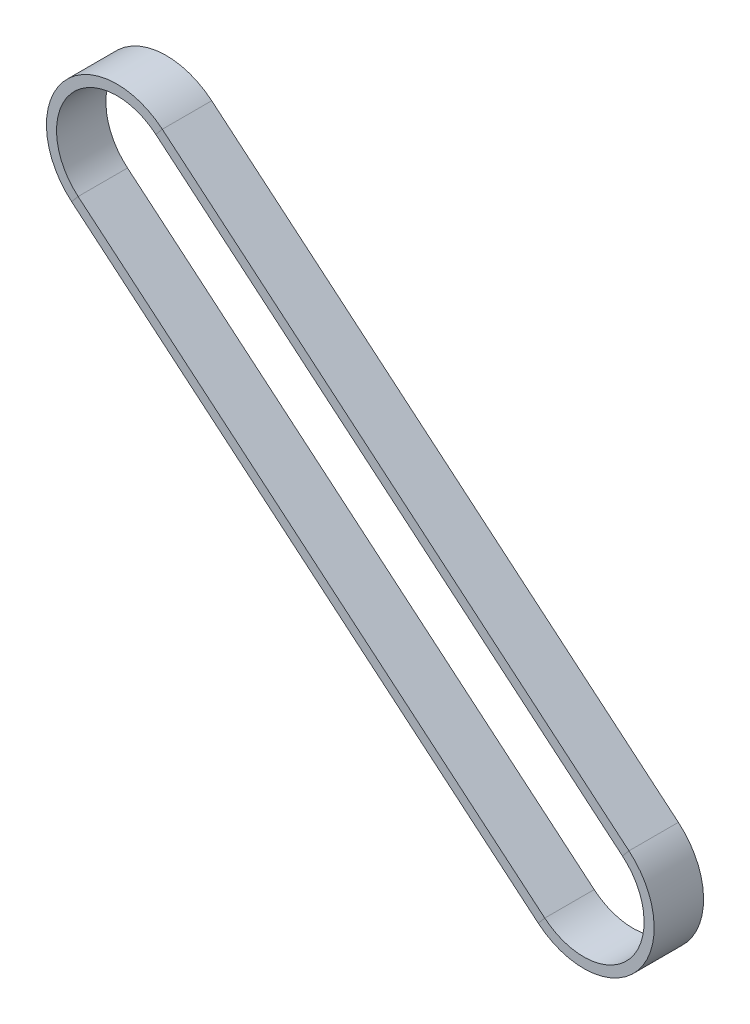
ISO-10303-21;
HEADER;
FILE_DESCRIPTION(('STEP AP214'),'2;1');
FILE_NAME('part.step','',(''),(''),'','','');
FILE_SCHEMA(('AUTOMOTIVE_DESIGN { 1 0 10303 214 1 1 1 1 }'));
ENDSEC;
DATA;
#1=APPLICATION_CONTEXT('core data for automotive mechanical design processes');
#2=APPLICATION_PROTOCOL_DEFINITION('international standard','automotive_design',2000,#1);
#3=PRODUCT_CONTEXT('',#1,'mechanical');
#4=PRODUCT('Part','Part','',(#3));
#5=PRODUCT_RELATED_PRODUCT_CATEGORY('part','',(#4));
#6=PRODUCT_DEFINITION_FORMATION('','',#4);
#7=PRODUCT_DEFINITION_CONTEXT('part definition',#1,'design');
#8=PRODUCT_DEFINITION('design','',#6,#7);
#9=PRODUCT_DEFINITION_SHAPE('','',#8);
#10=(LENGTH_UNIT() NAMED_UNIT(*) SI_UNIT(.MILLI.,.METRE.));
#11=(NAMED_UNIT(*) PLANE_ANGLE_UNIT() SI_UNIT($,.RADIAN.));
#12=(NAMED_UNIT(*) SI_UNIT($,.STERADIAN.) SOLID_ANGLE_UNIT());
#13=UNCERTAINTY_MEASURE_WITH_UNIT(LENGTH_MEASURE(1.E-05),#10,'distance_accuracy_value','');
#14=(GEOMETRIC_REPRESENTATION_CONTEXT(3) GLOBAL_UNCERTAINTY_ASSIGNED_CONTEXT((#13)) GLOBAL_UNIT_ASSIGNED_CONTEXT((#10,
#11,#12)) REPRESENTATION_CONTEXT('',''));
#15=CARTESIAN_POINT('',(0.,0.,0.));
#16=DIRECTION('',(0.,0.,1.));
#17=DIRECTION('',(1.,0.,0.));
#18=AXIS2_PLACEMENT_3D('',#15,#16,#17);
#19=CARTESIAN_POINT('',(-13.7664118631083,-16.4061707949908,7.5));
#20=DIRECTION('',(0.,0.,-1.));
#21=DIRECTION('',(-1.,0.,0.));
#22=AXIS2_PLACEMENT_3D('',#19,#20,#21);
#23=PLANE('',#22);
#24=DIRECTION('',(0.642787609686541,0.766044443118977,0.));
#25=VECTOR('',#24,1.);
#26=CARTESIAN_POINT('',(-13.7664118631083,-16.4061707949908,7.5));
#27=LINE('',#26,#25);
#28=CARTESIAN_POINT('',(-13.7664118631083,-16.4061707949908,7.5));
#29=VERTEX_POINT('',#28);
#30=CARTESIAN_POINT('',(-11.7994817774675,-14.0620747990467,7.5));
#31=VERTEX_POINT('',#30);
#32=EDGE_CURVE('E155',#29,#31,#27,.T.);
#33=ORIENTED_EDGE('',*,*,#32,.F.);
#34=CARTESIAN_POINT('',(0.,0.,7.5));
#35=DIRECTION('',(0.,0.,1.));
#36=DIRECTION('',(-0.64278760968654,-0.766044443118977,0.));
#37=AXIS2_PLACEMENT_3D('',#34,#35,#36);
#38=CIRCLE('',#37,21.4167349458114);
#39=CARTESIAN_POINT('',(13.7664118631083,16.4061707949908,7.5));
#40=VERTEX_POINT('',#39);
#41=EDGE_CURVE('E154',#29,#40,#38,.T.);
#42=ORIENTED_EDGE('',*,*,#41,.T.);
#43=DIRECTION('',(-0.642787609686541,-0.766044443118977,0.));
#44=VECTOR('',#43,1.);
#45=CARTESIAN_POINT('',(13.7664118631083,16.4061707949908,7.5));
#46=LINE('',#45,#44);
#47=CARTESIAN_POINT('',(11.7994817774675,14.0620747990467,7.5));
#48=VERTEX_POINT('',#47);
#49=EDGE_CURVE('E133',#40,#48,#46,.T.);
#50=ORIENTED_EDGE('',*,*,#49,.T.);
#51=CARTESIAN_POINT('',(0.,0.,7.5));
#52=DIRECTION('',(0.,0.,1.));
#53=DIRECTION('',(-0.64278760968654,-0.766044443118977,0.));
#54=AXIS2_PLACEMENT_3D('',#51,#52,#53);
#55=CIRCLE('',#54,18.3567349458114);
#56=EDGE_CURVE('E159',#31,#48,#55,.T.);
#57=ORIENTED_EDGE('',*,*,#56,.F.);
#58=EDGE_LOOP('',(#33,#42,#50,#57));
#59=FACE_BOUND('',#58,.T.);
#60=ADVANCED_FACE('F39',(#59),#23,.F.);
#61=CARTESIAN_POINT('',(13.7664118631083,16.4061707949908,7.5));
#62=DIRECTION('',(0.,0.,-1.));
#63=DIRECTION('',(0.,1.,0.));
#64=AXIS2_PLACEMENT_3D('',#61,#62,#63);
#65=PLANE('',#64);
#66=DIRECTION('',(-0.766044443118977,0.64278760968654,0.));
#67=VECTOR('',#66,1.);
#68=CARTESIAN_POINT('',(11.7994817774675,14.0620747990467,7.5));
#69=LINE('',#68,#67);
#70=CARTESIAN_POINT('',(-129.918740199543,132.977782591057,7.5));
#71=VERTEX_POINT('',#70);
#72=EDGE_CURVE('E123',#48,#71,#69,.T.);
#73=ORIENTED_EDGE('',*,*,#72,.F.);
#74=ORIENTED_EDGE('',*,*,#49,.F.);
#75=DIRECTION('',(-0.766044443118977,0.64278760968654,0.));
#76=VECTOR('',#75,1.);
#77=CARTESIAN_POINT('',(13.7664118631083,16.4061707949908,7.5));
#78=LINE('',#77,#76);
#79=CARTESIAN_POINT('',(-127.951810113902,135.321878587001,7.5));
#80=VERTEX_POINT('',#79);
#81=EDGE_CURVE('E136',#40,#80,#78,.T.);
#82=ORIENTED_EDGE('',*,*,#81,.T.);
#83=DIRECTION('',(-0.642787609686541,-0.766044443118977,0.));
#84=VECTOR('',#83,1.);
#85=CARTESIAN_POINT('',(-127.951810113902,135.321878587001,7.5));
#86=LINE('',#85,#84);
#87=EDGE_CURVE('E151',#80,#71,#86,.T.);
#88=ORIENTED_EDGE('',*,*,#87,.T.);
#89=EDGE_LOOP('',(#73,#74,#82,#88));
#90=FACE_BOUND('',#89,.T.);
#91=ADVANCED_FACE('F135',(#90),#65,.F.);
#92=CARTESIAN_POINT('',(11.7994817774675,14.0620747990467,7.5));
#93=DIRECTION('',(0.64278760968654,0.766044443118977,0.));
#94=DIRECTION('',(-0.766044443118977,0.642787609686541,0.));
#95=AXIS2_PLACEMENT_3D('',#92,#93,#94);
#96=PLANE('',#95);
#97=DIRECTION('',(-0.766044443118977,0.64278760968654,0.));
#98=VECTOR('',#97,1.);
#99=CARTESIAN_POINT('',(11.7994817774675,14.0620747990467,-7.5));
#100=LINE('',#99,#98);
#101=CARTESIAN_POINT('',(11.7994817774675,14.0620747990467,-7.5));
#102=VERTEX_POINT('',#101);
#103=CARTESIAN_POINT('',(-129.918740199543,132.977782591057,-7.5));
#104=VERTEX_POINT('',#103);
#105=EDGE_CURVE('E117',#102,#104,#100,.T.);
#106=ORIENTED_EDGE('',*,*,#105,.F.);
#107=DIRECTION('',(0.,0.,-1.));
#108=VECTOR('',#107,1.);
#109=CARTESIAN_POINT('',(11.7994817774675,14.0620747990467,7.5));
#110=LINE('',#109,#108);
#111=EDGE_CURVE('E141',#48,#102,#110,.T.);
#112=ORIENTED_EDGE('',*,*,#111,.F.);
#113=ORIENTED_EDGE('',*,*,#72,.T.);
#114=DIRECTION('',(0.,0.,-1.));
#115=VECTOR('',#114,1.);
#116=CARTESIAN_POINT('',(-129.918740199543,132.977782591057,7.5));
#117=LINE('',#116,#115);
#118=EDGE_CURVE('E199',#71,#104,#117,.T.);
#119=ORIENTED_EDGE('',*,*,#118,.T.);
#120=EDGE_LOOP('',(#106,#112,#113,#119));
#121=FACE_BOUND('',#120,.T.);
#122=ADVANCED_FACE('F218',(#121),#96,.F.);
#123=CARTESIAN_POINT('',(13.7664118631083,16.4061707949908,-7.5));
#124=DIRECTION('',(0.,0.,1.));
#125=DIRECTION('',(0.,-1.,0.));
#126=AXIS2_PLACEMENT_3D('',#123,#124,#125);
#127=PLANE('',#126);
#128=DIRECTION('',(-0.766044443118977,0.64278760968654,0.));
#129=VECTOR('',#128,1.);
#130=CARTESIAN_POINT('',(13.7664118631083,16.4061707949908,-7.5));
#131=LINE('',#130,#129);
#132=CARTESIAN_POINT('',(13.7664118631083,16.4061707949908,-7.5));
#133=VERTEX_POINT('',#132);
#134=CARTESIAN_POINT('',(-127.951810113902,135.321878587001,-7.5));
#135=VERTEX_POINT('',#134);
#136=EDGE_CURVE('E169',#133,#135,#131,.T.);
#137=ORIENTED_EDGE('',*,*,#136,.F.);
#138=DIRECTION('',(0.642787609686541,0.766044443118977,0.));
#139=VECTOR('',#138,1.);
#140=CARTESIAN_POINT('',(13.7664118631083,16.4061707949908,-7.5));
#141=LINE('',#140,#139);
#142=EDGE_CURVE('E162',#102,#133,#141,.T.);
#143=ORIENTED_EDGE('',*,*,#142,.F.);
#144=ORIENTED_EDGE('',*,*,#105,.T.);
#145=DIRECTION('',(0.642787609686541,0.766044443118977,0.));
#146=VECTOR('',#145,1.);
#147=CARTESIAN_POINT('',(-127.951810113902,135.321878587001,-7.5));
#148=LINE('',#147,#146);
#149=EDGE_CURVE('E187',#104,#135,#148,.T.);
#150=ORIENTED_EDGE('',*,*,#149,.T.);
#151=EDGE_LOOP('',(#137,#143,#144,#150));
#152=FACE_BOUND('',#151,.T.);
#153=ADVANCED_FACE('F186',(#152),#127,.F.);
#154=CARTESIAN_POINT('',(13.7664118631083,16.4061707949908,7.5));
#155=DIRECTION('',(-0.64278760968654,-0.766044443118977,0.));
#156=DIRECTION('',(0.766044443118977,-0.642787609686541,0.));
#157=AXIS2_PLACEMENT_3D('',#154,#155,#156);
#158=PLANE('',#157);
#159=DIRECTION('',(0.,0.,1.));
#160=VECTOR('',#159,1.);
#161=CARTESIAN_POINT('',(-127.951810113902,135.321878587001,7.5));
#162=LINE('',#161,#160);
#163=EDGE_CURVE('E149',#135,#80,#162,.T.);
#164=ORIENTED_EDGE('',*,*,#163,.T.);
#165=ORIENTED_EDGE('',*,*,#81,.F.);
#166=DIRECTION('',(0.,0.,1.));
#167=VECTOR('',#166,1.);
#168=CARTESIAN_POINT('',(13.7664118631083,16.4061707949908,7.5));
#169=LINE('',#168,#167);
#170=EDGE_CURVE('E148',#133,#40,#169,.T.);
#171=ORIENTED_EDGE('',*,*,#170,.F.);
#172=ORIENTED_EDGE('',*,*,#136,.T.);
#173=EDGE_LOOP('',(#164,#165,#171,#172));
#174=FACE_BOUND('',#173,.T.);
#175=ADVANCED_FACE('F146',(#174),#158,.F.);
#176=CARTESIAN_POINT('',(-127.951810113902,135.321878587001,7.5));
#177=DIRECTION('',(0.,0.,-1.));
#178=DIRECTION('',(-1.,0.,0.));
#179=AXIS2_PLACEMENT_3D('',#176,#177,#178);
#180=PLANE('',#179);
#181=CARTESIAN_POINT('',(-141.718221977011,118.91570779201,7.5));
#182=DIRECTION('',(0.,0.,1.));
#183=DIRECTION('',(0.642787609686542,0.766044443118976,0.));
#184=AXIS2_PLACEMENT_3D('',#181,#182,#183);
#185=CIRCLE('',#184,18.3567349458114);
#186=CARTESIAN_POINT('',(-153.517703754478,104.853632992963,7.5));
#187=VERTEX_POINT('',#186);
#188=EDGE_CURVE('E104',#71,#187,#185,.T.);
#189=ORIENTED_EDGE('',*,*,#188,.F.);
#190=ORIENTED_EDGE('',*,*,#87,.F.);
#191=CARTESIAN_POINT('',(-141.718221977011,118.91570779201,7.5));
#192=DIRECTION('',(0.,0.,1.));
#193=DIRECTION('',(0.642787609686541,0.766044443118976,0.));
#194=AXIS2_PLACEMENT_3D('',#191,#192,#193);
#195=CIRCLE('',#194,21.4167349458114);
#196=CARTESIAN_POINT('',(-155.484633840119,102.509536997019,7.5));
#197=VERTEX_POINT('',#196);
#198=EDGE_CURVE('E168',#80,#197,#195,.T.);
#199=ORIENTED_EDGE('',*,*,#198,.T.);
#200=DIRECTION('',(0.642787609686541,0.766044443118977,0.));
#201=VECTOR('',#200,1.);
#202=CARTESIAN_POINT('',(-155.484633840119,102.509536997019,7.5));
#203=LINE('',#202,#201);
#204=EDGE_CURVE('E209',#197,#187,#203,.T.);
#205=ORIENTED_EDGE('',*,*,#204,.T.);
#206=EDGE_LOOP('',(#189,#190,#199,#205));
#207=FACE_BOUND('',#206,.T.);
#208=ADVANCED_FACE('F214',(#207),#180,.F.);
#209=CARTESIAN_POINT('',(-141.718221977011,118.91570779201,0.));
#210=DIRECTION('',(0.,0.,1.));
#211=DIRECTION('',(1.,0.,0.));
#212=AXIS2_PLACEMENT_3D('',#209,#210,#211);
#213=CYLINDRICAL_SURFACE('',#212,18.3567349458114);
#214=CARTESIAN_POINT('',(-141.718221977011,118.91570779201,-7.5));
#215=DIRECTION('',(0.,0.,1.));
#216=DIRECTION('',(0.642787609686542,0.766044443118976,0.));
#217=AXIS2_PLACEMENT_3D('',#214,#215,#216);
#218=CIRCLE('',#217,18.3567349458114);
#219=CARTESIAN_POINT('',(-153.517703754478,104.853632992963,-7.5));
#220=VERTEX_POINT('',#219);
#221=EDGE_CURVE('E97',#104,#220,#218,.T.);
#222=ORIENTED_EDGE('',*,*,#221,.F.);
#223=ORIENTED_EDGE('',*,*,#118,.F.);
#224=ORIENTED_EDGE('',*,*,#188,.T.);
#225=DIRECTION('',(0.,0.,-1.));
#226=VECTOR('',#225,1.);
#227=CARTESIAN_POINT('',(-153.517703754478,104.853632992963,7.5));
#228=LINE('',#227,#226);
#229=EDGE_CURVE('E196',#187,#220,#228,.T.);
#230=ORIENTED_EDGE('',*,*,#229,.T.);
#231=EDGE_LOOP('',(#222,#223,#224,#230));
#232=FACE_BOUND('',#231,.T.);
#233=ADVANCED_FACE('F217',(#232),#213,.F.);
#234=CARTESIAN_POINT('',(-127.951810113902,135.321878587001,-7.5));
#235=DIRECTION('',(0.,0.,1.));
#236=DIRECTION('',(1.,0.,0.));
#237=AXIS2_PLACEMENT_3D('',#234,#235,#236);
#238=PLANE('',#237);
#239=CARTESIAN_POINT('',(-141.718221977011,118.91570779201,-7.5));
#240=DIRECTION('',(0.,0.,1.));
#241=DIRECTION('',(0.642787609686541,0.766044443118976,0.));
#242=AXIS2_PLACEMENT_3D('',#239,#240,#241);
#243=CIRCLE('',#242,21.4167349458114);
#244=CARTESIAN_POINT('',(-155.484633840119,102.509536997019,-7.5));
#245=VERTEX_POINT('',#244);
#246=EDGE_CURVE('E88',#135,#245,#243,.T.);
#247=ORIENTED_EDGE('',*,*,#246,.F.);
#248=ORIENTED_EDGE('',*,*,#149,.F.);
#249=ORIENTED_EDGE('',*,*,#221,.T.);
#250=DIRECTION('',(-0.642787609686541,-0.766044443118977,0.));
#251=VECTOR('',#250,1.);
#252=CARTESIAN_POINT('',(-155.484633840119,102.509536997019,-7.5));
#253=LINE('',#252,#251);
#254=EDGE_CURVE('E174',#220,#245,#253,.T.);
#255=ORIENTED_EDGE('',*,*,#254,.T.);
#256=EDGE_LOOP('',(#247,#248,#249,#255));
#257=FACE_BOUND('',#256,.T.);
#258=ADVANCED_FACE('F236',(#257),#238,.F.);
#259=CARTESIAN_POINT('',(-141.718221977011,118.91570779201,0.));
#260=DIRECTION('',(0.,0.,1.));
#261=DIRECTION('',(1.,0.,0.));
#262=AXIS2_PLACEMENT_3D('',#259,#260,#261);
#263=CYLINDRICAL_SURFACE('',#262,21.4167349458114);
#264=DIRECTION('',(0.,0.,1.));
#265=VECTOR('',#264,1.);
#266=CARTESIAN_POINT('',(-155.484633840119,102.509536997019,7.5));
#267=LINE('',#266,#265);
#268=EDGE_CURVE('E170',#245,#197,#267,.T.);
#269=ORIENTED_EDGE('',*,*,#268,.T.);
#270=ORIENTED_EDGE('',*,*,#198,.F.);
#271=ORIENTED_EDGE('',*,*,#163,.F.);
#272=ORIENTED_EDGE('',*,*,#246,.T.);
#273=EDGE_LOOP('',(#269,#270,#271,#272));
#274=FACE_BOUND('',#273,.T.);
#275=ADVANCED_FACE('F228',(#274),#263,.T.);
#276=CARTESIAN_POINT('',(-155.484633840119,102.509536997019,7.5));
#277=DIRECTION('',(0.,0.,-1.));
#278=DIRECTION('',(0.,1.,0.));
#279=AXIS2_PLACEMENT_3D('',#276,#277,#278);
#280=PLANE('',#279);
#281=DIRECTION('',(0.766044443118977,-0.64278760968654,0.));
#282=VECTOR('',#281,1.);
#283=CARTESIAN_POINT('',(-153.517703754478,104.853632992963,7.5));
#284=LINE('',#283,#282);
#285=EDGE_CURVE('E194',#187,#31,#284,.T.);
#286=ORIENTED_EDGE('',*,*,#285,.F.);
#287=ORIENTED_EDGE('',*,*,#204,.F.);
#288=DIRECTION('',(0.766044443118977,-0.64278760968654,0.));
#289=VECTOR('',#288,1.);
#290=CARTESIAN_POINT('',(-155.484633840119,102.509536997019,7.5));
#291=LINE('',#290,#289);
#292=EDGE_CURVE('E171',#197,#29,#291,.T.);
#293=ORIENTED_EDGE('',*,*,#292,.T.);
#294=ORIENTED_EDGE('',*,*,#32,.T.);
#295=EDGE_LOOP('',(#286,#287,#293,#294));
#296=FACE_BOUND('',#295,.T.);
#297=ADVANCED_FACE('F226',(#296),#280,.F.);
#298=CARTESIAN_POINT('',(-153.517703754478,104.853632992963,7.5));
#299=DIRECTION('',(-0.64278760968654,-0.766044443118977,0.));
#300=DIRECTION('',(0.766044443118977,-0.642787609686541,0.));
#301=AXIS2_PLACEMENT_3D('',#298,#299,#300);
#302=PLANE('',#301);
#303=DIRECTION('',(0.766044443118977,-0.64278760968654,0.));
#304=VECTOR('',#303,1.);
#305=CARTESIAN_POINT('',(-153.517703754478,104.853632992963,-7.5));
#306=LINE('',#305,#304);
#307=CARTESIAN_POINT('',(-11.7994817774675,-14.0620747990467,-7.5));
#308=VERTEX_POINT('',#307);
#309=EDGE_CURVE('E64',#220,#308,#306,.T.);
#310=ORIENTED_EDGE('',*,*,#309,.F.);
#311=ORIENTED_EDGE('',*,*,#229,.F.);
#312=ORIENTED_EDGE('',*,*,#285,.T.);
#313=DIRECTION('',(0.,0.,-1.));
#314=VECTOR('',#313,1.);
#315=CARTESIAN_POINT('',(-11.7994817774675,-14.0620747990467,7.5));
#316=LINE('',#315,#314);
#317=EDGE_CURVE('E192',#31,#308,#316,.T.);
#318=ORIENTED_EDGE('',*,*,#317,.T.);
#319=EDGE_LOOP('',(#310,#311,#312,#318));
#320=FACE_BOUND('',#319,.T.);
#321=ADVANCED_FACE('F223',(#320),#302,.F.);
#322=CARTESIAN_POINT('',(-155.484633840119,102.509536997019,-7.5));
#323=DIRECTION('',(0.,0.,1.));
#324=DIRECTION('',(0.,-1.,0.));
#325=AXIS2_PLACEMENT_3D('',#322,#323,#324);
#326=PLANE('',#325);
#327=DIRECTION('',(0.766044443118977,-0.64278760968654,0.));
#328=VECTOR('',#327,1.);
#329=CARTESIAN_POINT('',(-155.484633840119,102.509536997019,-7.5));
#330=LINE('',#329,#328);
#331=CARTESIAN_POINT('',(-13.7664118631083,-16.4061707949908,-7.5));
#332=VERTEX_POINT('',#331);
#333=EDGE_CURVE('E56',#245,#332,#330,.T.);
#334=ORIENTED_EDGE('',*,*,#333,.F.);
#335=ORIENTED_EDGE('',*,*,#254,.F.);
#336=ORIENTED_EDGE('',*,*,#309,.T.);
#337=DIRECTION('',(-0.642787609686541,-0.766044443118977,0.));
#338=VECTOR('',#337,1.);
#339=CARTESIAN_POINT('',(-13.7664118631083,-16.4061707949908,-7.5));
#340=LINE('',#339,#338);
#341=EDGE_CURVE('E179',#308,#332,#340,.T.);
#342=ORIENTED_EDGE('',*,*,#341,.T.);
#343=EDGE_LOOP('',(#334,#335,#336,#342));
#344=FACE_BOUND('',#343,.T.);
#345=ADVANCED_FACE('F234',(#344),#326,.F.);
#346=CARTESIAN_POINT('',(-155.484633840119,102.509536997019,7.5));
#347=DIRECTION('',(0.64278760968654,0.766044443118977,0.));
#348=DIRECTION('',(-0.766044443118977,0.642787609686541,0.));
#349=AXIS2_PLACEMENT_3D('',#346,#347,#348);
#350=PLANE('',#349);
#351=DIRECTION('',(0.,0.,1.));
#352=VECTOR('',#351,1.);
#353=CARTESIAN_POINT('',(-13.7664118631083,-16.4061707949908,7.5));
#354=LINE('',#353,#352);
#355=EDGE_CURVE('E43',#332,#29,#354,.T.);
#356=ORIENTED_EDGE('',*,*,#355,.T.);
#357=ORIENTED_EDGE('',*,*,#292,.F.);
#358=ORIENTED_EDGE('',*,*,#268,.F.);
#359=ORIENTED_EDGE('',*,*,#333,.T.);
#360=EDGE_LOOP('',(#356,#357,#358,#359));
#361=FACE_BOUND('',#360,.T.);
#362=ADVANCED_FACE('F180',(#361),#350,.F.);
#363=CARTESIAN_POINT('',(0.,0.,0.));
#364=DIRECTION('',(0.,0.,1.));
#365=DIRECTION('',(1.,0.,0.));
#366=AXIS2_PLACEMENT_3D('',#363,#364,#365);
#367=CYLINDRICAL_SURFACE('',#366,18.3567349458114);
#368=ORIENTED_EDGE('',*,*,#56,.T.);
#369=ORIENTED_EDGE('',*,*,#111,.T.);
#370=CARTESIAN_POINT('',(0.,0.,-7.5));
#371=DIRECTION('',(0.,0.,1.));
#372=DIRECTION('',(-0.64278760968654,-0.766044443118977,0.));
#373=AXIS2_PLACEMENT_3D('',#370,#371,#372);
#374=CIRCLE('',#373,18.3567349458114);
#375=EDGE_CURVE('E48',#308,#102,#374,.T.);
#376=ORIENTED_EDGE('',*,*,#375,.F.);
#377=ORIENTED_EDGE('',*,*,#317,.F.);
#378=EDGE_LOOP('',(#368,#369,#376,#377));
#379=FACE_BOUND('',#378,.T.);
#380=ADVANCED_FACE('F220',(#379),#367,.F.);
#381=CARTESIAN_POINT('',(-13.7664118631083,-16.4061707949908,-7.5));
#382=DIRECTION('',(0.,0.,1.));
#383=DIRECTION('',(1.,0.,0.));
#384=AXIS2_PLACEMENT_3D('',#381,#382,#383);
#385=PLANE('',#384);
#386=ORIENTED_EDGE('',*,*,#375,.T.);
#387=ORIENTED_EDGE('',*,*,#142,.T.);
#388=CARTESIAN_POINT('',(0.,0.,-7.5));
#389=DIRECTION('',(0.,0.,1.));
#390=DIRECTION('',(-0.64278760968654,-0.766044443118977,0.));
#391=AXIS2_PLACEMENT_3D('',#388,#389,#390);
#392=CIRCLE('',#391,21.4167349458114);
#393=EDGE_CURVE('E11',#332,#133,#392,.T.);
#394=ORIENTED_EDGE('',*,*,#393,.F.);
#395=ORIENTED_EDGE('',*,*,#341,.F.);
#396=EDGE_LOOP('',(#386,#387,#394,#395));
#397=FACE_BOUND('',#396,.T.);
#398=ADVANCED_FACE('F184',(#397),#385,.F.);
#399=CARTESIAN_POINT('',(0.,0.,0.));
#400=DIRECTION('',(0.,0.,1.));
#401=DIRECTION('',(1.,0.,0.));
#402=AXIS2_PLACEMENT_3D('',#399,#400,#401);
#403=CYLINDRICAL_SURFACE('',#402,21.4167349458114);
#404=ORIENTED_EDGE('',*,*,#393,.T.);
#405=ORIENTED_EDGE('',*,*,#170,.T.);
#406=ORIENTED_EDGE('',*,*,#41,.F.);
#407=ORIENTED_EDGE('',*,*,#355,.F.);
#408=EDGE_LOOP('',(#404,#405,#406,#407));
#409=FACE_BOUND('',#408,.T.);
#410=ADVANCED_FACE('F41',(#409),#403,.T.);
#411=CLOSED_SHELL('',(#60,#91,#122,#153,#175,#208,#233,#258,#275,#297,#321,#345,#362,#380,#398,#410));
#412=MANIFOLD_SOLID_BREP('B2',#411);
#413=ADVANCED_BREP_SHAPE_REPRESENTATION('',(#18,#412),#14);
#414=SHAPE_DEFINITION_REPRESENTATION(#9,#413);
ENDSEC;
END-ISO-10303-21;
